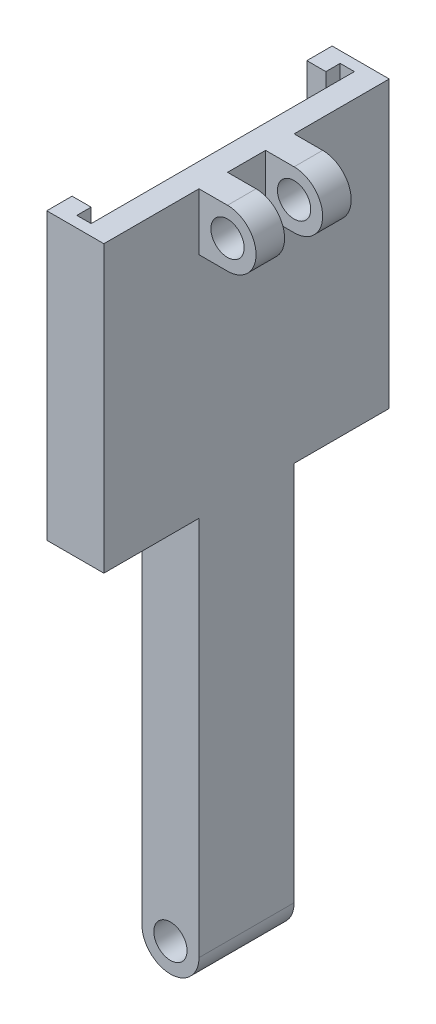
ISO-10303-21;
HEADER;
FILE_DESCRIPTION(('STEP AP214'),'2;1');
FILE_NAME('part.step','',(''),(''),'','','');
FILE_SCHEMA(('AUTOMOTIVE_DESIGN { 1 0 10303 214 1 1 1 1 }'));
ENDSEC;
DATA;
#1=APPLICATION_CONTEXT('core data for automotive mechanical design processes');
#2=APPLICATION_PROTOCOL_DEFINITION('international standard','automotive_design',2000,#1);
#3=PRODUCT_CONTEXT('',#1,'mechanical');
#4=PRODUCT('Part','Part','',(#3));
#5=PRODUCT_RELATED_PRODUCT_CATEGORY('part','',(#4));
#6=PRODUCT_DEFINITION_FORMATION('','',#4);
#7=PRODUCT_DEFINITION_CONTEXT('part definition',#1,'design');
#8=PRODUCT_DEFINITION('design','',#6,#7);
#9=PRODUCT_DEFINITION_SHAPE('','',#8);
#10=(LENGTH_UNIT() NAMED_UNIT(*) SI_UNIT(.MILLI.,.METRE.));
#11=(NAMED_UNIT(*) PLANE_ANGLE_UNIT() SI_UNIT($,.RADIAN.));
#12=(NAMED_UNIT(*) SI_UNIT($,.STERADIAN.) SOLID_ANGLE_UNIT());
#13=UNCERTAINTY_MEASURE_WITH_UNIT(LENGTH_MEASURE(1.E-05),#10,'distance_accuracy_value','');
#14=(GEOMETRIC_REPRESENTATION_CONTEXT(3) GLOBAL_UNCERTAINTY_ASSIGNED_CONTEXT((#13)) GLOBAL_UNIT_ASSIGNED_CONTEXT((#10,
#11,#12)) REPRESENTATION_CONTEXT('',''));
#15=CARTESIAN_POINT('',(0.,0.,0.));
#16=DIRECTION('',(0.,0.,1.));
#17=DIRECTION('',(1.,0.,0.));
#18=AXIS2_PLACEMENT_3D('',#15,#16,#17);
#19=CARTESIAN_POINT('',(6.,67.,-8.48528137423858));
#20=DIRECTION('',(0.,0.,1.));
#21=DIRECTION('',(1.,0.,0.));
#22=AXIS2_PLACEMENT_3D('',#19,#20,#21);
#23=CYLINDRICAL_SURFACE('',#22,3.);
#24=CARTESIAN_POINT('',(6.,67.,7.));
#25=DIRECTION('',(0.,0.,1.));
#26=DIRECTION('',(1.,0.,0.));
#27=AXIS2_PLACEMENT_3D('',#24,#25,#26);
#28=CIRCLE('',#27,3.);
#29=CARTESIAN_POINT('',(6.,70.,7.));
#30=VERTEX_POINT('',#29);
#31=CARTESIAN_POINT('',(6.,64.,7.));
#32=VERTEX_POINT('',#31);
#33=EDGE_CURVE('E257',#30,#32,#28,.F.);
#34=ORIENTED_EDGE('',*,*,#33,.F.);
#35=DIRECTION('',(0.,0.,1.));
#36=VECTOR('',#35,1.);
#37=CARTESIAN_POINT('',(6.,70.,-8.48528137423858));
#38=LINE('',#37,#36);
#39=CARTESIAN_POINT('',(6.,70.,10.));
#40=VERTEX_POINT('',#39);
#41=EDGE_CURVE('E260',#30,#40,#38,.T.);
#42=ORIENTED_EDGE('',*,*,#41,.T.);
#43=CARTESIAN_POINT('',(6.,67.,10.));
#44=DIRECTION('',(0.,0.,1.));
#45=DIRECTION('',(1.,0.,0.));
#46=AXIS2_PLACEMENT_3D('',#43,#44,#45);
#47=CIRCLE('',#46,3.);
#48=CARTESIAN_POINT('',(6.,64.,10.));
#49=VERTEX_POINT('',#48);
#50=EDGE_CURVE('E275',#49,#40,#47,.T.);
#51=ORIENTED_EDGE('',*,*,#50,.F.);
#52=DIRECTION('',(0.,0.,1.));
#53=VECTOR('',#52,1.);
#54=CARTESIAN_POINT('',(6.,64.,-8.48528137423858));
#55=LINE('',#54,#53);
#56=EDGE_CURVE('E294',#32,#49,#55,.T.);
#57=ORIENTED_EDGE('',*,*,#56,.F.);
#58=EDGE_LOOP('',(#34,#42,#51,#57));
#59=FACE_BOUND('',#58,.T.);
#60=ADVANCED_FACE('F54',(#59),#23,.T.);
#61=CARTESIAN_POINT('',(0.,64.,-8.48528137423858));
#62=DIRECTION('',(0.,1.,0.));
#63=DIRECTION('',(0.,0.,1.));
#64=AXIS2_PLACEMENT_3D('',#61,#62,#63);
#65=PLANE('',#64);
#66=DIRECTION('',(0.,0.,1.));
#67=VECTOR('',#66,1.);
#68=CARTESIAN_POINT('',(3.,64.,-8.48528137423858));
#69=LINE('',#68,#67);
#70=CARTESIAN_POINT('',(3.,64.,7.));
#71=VERTEX_POINT('',#70);
#72=CARTESIAN_POINT('',(3.,64.,10.));
#73=VERTEX_POINT('',#72);
#74=EDGE_CURVE('E265',#71,#73,#69,.T.);
#75=ORIENTED_EDGE('',*,*,#74,.F.);
#76=DIRECTION('',(-1.,0.,0.));
#77=VECTOR('',#76,1.);
#78=CARTESIAN_POINT('',(9.,64.,7.));
#79=LINE('',#78,#77);
#80=EDGE_CURVE('E249',#32,#71,#79,.T.);
#81=ORIENTED_EDGE('',*,*,#80,.F.);
#82=ORIENTED_EDGE('',*,*,#56,.T.);
#83=DIRECTION('',(-1.,0.,0.));
#84=VECTOR('',#83,1.);
#85=CARTESIAN_POINT('',(0.,64.,10.));
#86=LINE('',#85,#84);
#87=EDGE_CURVE('E261',#49,#73,#86,.T.);
#88=ORIENTED_EDGE('',*,*,#87,.T.);
#89=EDGE_LOOP('',(#75,#81,#82,#88));
#90=FACE_BOUND('',#89,.T.);
#91=ADVANCED_FACE('F489',(#90),#65,.F.);
#92=CARTESIAN_POINT('',(6.,67.,-8.48528137423858));
#93=DIRECTION('',(0.,0.,1.));
#94=DIRECTION('',(1.,0.,0.));
#95=AXIS2_PLACEMENT_3D('',#92,#93,#94);
#96=CYLINDRICAL_SURFACE('',#95,1.75);
#97=CARTESIAN_POINT('',(6.,67.,7.));
#98=DIRECTION('',(0.,0.,1.));
#99=DIRECTION('',(1.,0.,0.));
#100=AXIS2_PLACEMENT_3D('',#97,#98,#99);
#101=CIRCLE('',#100,1.75);
#102=CARTESIAN_POINT('',(7.75,67.,7.));
#103=VERTEX_POINT('',#102);
#104=EDGE_CURVE('E58',#103,#103,#101,.F.);
#105=ORIENTED_EDGE('',*,*,#104,.T.);
#106=EDGE_LOOP('',(#105));
#107=FACE_BOUND('',#106,.T.);
#108=CARTESIAN_POINT('',(6.,67.,10.));
#109=DIRECTION('',(0.,0.,1.));
#110=DIRECTION('',(1.,0.,0.));
#111=AXIS2_PLACEMENT_3D('',#108,#109,#110);
#112=CIRCLE('',#111,1.75);
#113=CARTESIAN_POINT('',(7.75,67.,10.));
#114=VERTEX_POINT('',#113);
#115=EDGE_CURVE('E279',#114,#114,#112,.T.);
#116=ORIENTED_EDGE('',*,*,#115,.T.);
#117=EDGE_LOOP('',(#116));
#118=FACE_BOUND('',#117,.T.);
#119=ADVANCED_FACE('F496',(#107,#118),#96,.F.);
#120=CARTESIAN_POINT('',(0.,0.,10.));
#121=DIRECTION('',(0.,0.,1.));
#122=DIRECTION('',(1.,0.,0.));
#123=AXIS2_PLACEMENT_3D('',#120,#121,#122);
#124=PLANE('',#123);
#125=DIRECTION('',(1.,0.,0.));
#126=VECTOR('',#125,1.);
#127=CARTESIAN_POINT('',(0.,40.,10.));
#128=LINE('',#127,#126);
#129=CARTESIAN_POINT('',(-3.,40.,10.));
#130=VERTEX_POINT('',#129);
#131=CARTESIAN_POINT('',(3.,40.,10.));
#132=VERTEX_POINT('',#131);
#133=EDGE_CURVE('E427',#130,#132,#128,.T.);
#134=ORIENTED_EDGE('',*,*,#133,.F.);
#135=DIRECTION('',(0.,1.,0.));
#136=VECTOR('',#135,1.);
#137=CARTESIAN_POINT('',(-3.,0.,10.));
#138=LINE('',#137,#136);
#139=CARTESIAN_POINT('',(-3.,0.,10.));
#140=VERTEX_POINT('',#139);
#141=EDGE_CURVE('E448',#140,#130,#138,.T.);
#142=ORIENTED_EDGE('',*,*,#141,.F.);
#143=CARTESIAN_POINT('',(0.,0.,10.));
#144=DIRECTION('',(0.,0.,1.));
#145=DIRECTION('',(1.,0.,0.));
#146=AXIS2_PLACEMENT_3D('',#143,#144,#145);
#147=CIRCLE('',#146,3.);
#148=CARTESIAN_POINT('',(3.,0.,10.));
#149=VERTEX_POINT('',#148);
#150=EDGE_CURVE('E439',#140,#149,#147,.T.);
#151=ORIENTED_EDGE('',*,*,#150,.T.);
#152=DIRECTION('',(0.,1.,0.));
#153=VECTOR('',#152,1.);
#154=CARTESIAN_POINT('',(3.,0.,10.));
#155=LINE('',#154,#153);
#156=EDGE_CURVE('E443',#149,#132,#155,.T.);
#157=ORIENTED_EDGE('',*,*,#156,.T.);
#158=EDGE_LOOP('',(#134,#142,#151,#157));
#159=FACE_BOUND('',#158,.T.);
#160=CARTESIAN_POINT('',(0.,0.,10.));
#161=DIRECTION('',(0.,0.,1.));
#162=DIRECTION('',(1.,0.,0.));
#163=AXIS2_PLACEMENT_3D('',#160,#161,#162);
#164=CIRCLE('',#163,1.75);
#165=CARTESIAN_POINT('',(1.75,0.,10.));
#166=VERTEX_POINT('',#165);
#167=EDGE_CURVE('E431',#166,#166,#164,.T.);
#168=ORIENTED_EDGE('',*,*,#167,.F.);
#169=EDGE_LOOP('',(#168));
#170=FACE_BOUND('',#169,.T.);
#171=ADVANCED_FACE('F538',(#159,#170),#124,.T.);
#172=CARTESIAN_POINT('',(0.,0.,0.));
#173=DIRECTION('',(0.,0.,1.));
#174=DIRECTION('',(1.,0.,0.));
#175=AXIS2_PLACEMENT_3D('',#172,#173,#174);
#176=PLANE('',#175);
#177=DIRECTION('',(0.,1.,0.));
#178=VECTOR('',#177,1.);
#179=CARTESIAN_POINT('',(-3.,0.,0.));
#180=LINE('',#179,#178);
#181=CARTESIAN_POINT('',(-3.,0.,0.));
#182=VERTEX_POINT('',#181);
#183=CARTESIAN_POINT('',(-3.,40.,0.));
#184=VERTEX_POINT('',#183);
#185=EDGE_CURVE('E444',#182,#184,#180,.T.);
#186=ORIENTED_EDGE('',*,*,#185,.T.);
#187=DIRECTION('',(1.,0.,0.));
#188=VECTOR('',#187,1.);
#189=CARTESIAN_POINT('',(0.,40.,0.));
#190=LINE('',#189,#188);
#191=CARTESIAN_POINT('',(3.,40.,0.));
#192=VERTEX_POINT('',#191);
#193=EDGE_CURVE('E414',#184,#192,#190,.T.);
#194=ORIENTED_EDGE('',*,*,#193,.T.);
#195=DIRECTION('',(0.,1.,0.));
#196=VECTOR('',#195,1.);
#197=CARTESIAN_POINT('',(3.,0.,0.));
#198=LINE('',#197,#196);
#199=CARTESIAN_POINT('',(3.,0.,0.));
#200=VERTEX_POINT('',#199);
#201=EDGE_CURVE('E456',#200,#192,#198,.T.);
#202=ORIENTED_EDGE('',*,*,#201,.F.);
#203=CARTESIAN_POINT('',(0.,0.,0.));
#204=DIRECTION('',(0.,0.,1.));
#205=DIRECTION('',(1.,0.,0.));
#206=AXIS2_PLACEMENT_3D('',#203,#204,#205);
#207=CIRCLE('',#206,3.);
#208=EDGE_CURVE('E435',#182,#200,#207,.T.);
#209=ORIENTED_EDGE('',*,*,#208,.F.);
#210=EDGE_LOOP('',(#186,#194,#202,#209));
#211=FACE_BOUND('',#210,.T.);
#212=CARTESIAN_POINT('',(0.,0.,0.));
#213=DIRECTION('',(0.,0.,1.));
#214=DIRECTION('',(1.,0.,0.));
#215=AXIS2_PLACEMENT_3D('',#212,#213,#214);
#216=CIRCLE('',#215,1.75);
#217=CARTESIAN_POINT('',(1.75,0.,0.));
#218=VERTEX_POINT('',#217);
#219=EDGE_CURVE('E430',#218,#218,#216,.T.);
#220=ORIENTED_EDGE('',*,*,#219,.T.);
#221=EDGE_LOOP('',(#220));
#222=FACE_BOUND('',#221,.T.);
#223=ADVANCED_FACE('F633',(#211,#222),#176,.F.);
#224=CARTESIAN_POINT('',(0.,0.,10.));
#225=DIRECTION('',(0.,0.,-1.));
#226=DIRECTION('',(-1.,0.,0.));
#227=AXIS2_PLACEMENT_3D('',#224,#225,#226);
#228=CYLINDRICAL_SURFACE('',#227,3.);
#229=ORIENTED_EDGE('',*,*,#208,.T.);
#230=DIRECTION('',(0.,0.,-1.));
#231=VECTOR('',#230,1.);
#232=CARTESIAN_POINT('',(3.,0.,10.));
#233=LINE('',#232,#231);
#234=EDGE_CURVE('E12',#149,#200,#233,.T.);
#235=ORIENTED_EDGE('',*,*,#234,.F.);
#236=ORIENTED_EDGE('',*,*,#150,.F.);
#237=DIRECTION('',(0.,0.,-1.));
#238=VECTOR('',#237,1.);
#239=CARTESIAN_POINT('',(-3.,0.,10.));
#240=LINE('',#239,#238);
#241=EDGE_CURVE('E452',#140,#182,#240,.T.);
#242=ORIENTED_EDGE('',*,*,#241,.T.);
#243=EDGE_LOOP('',(#229,#235,#236,#242));
#244=FACE_BOUND('',#243,.T.);
#245=ADVANCED_FACE('F56',(#244),#228,.T.);
#246=CARTESIAN_POINT('',(3.,0.,10.));
#247=DIRECTION('',(-1.,0.,0.));
#248=DIRECTION('',(0.,0.,1.));
#249=AXIS2_PLACEMENT_3D('',#246,#247,#248);
#250=PLANE('',#249);
#251=CARTESIAN_POINT('',(3.,64.,0.));
#252=VERTEX_POINT('',#251);
#253=CARTESIAN_POINT('',(3.,64.,3.));
#254=VERTEX_POINT('',#253);
#255=EDGE_CURVE('E234',#252,#254,#69,.T.);
#256=ORIENTED_EDGE('',*,*,#255,.T.);
#257=DIRECTION('',(0.,1.,0.));
#258=VECTOR('',#257,1.);
#259=CARTESIAN_POINT('',(3.,56.788897449072,3.));
#260=LINE('',#259,#258);
#261=CARTESIAN_POINT('',(3.,70.,3.));
#262=VERTEX_POINT('',#261);
#263=EDGE_CURVE('E72',#254,#262,#260,.T.);
#264=ORIENTED_EDGE('',*,*,#263,.T.);
#265=DIRECTION('',(0.,0.,1.));
#266=VECTOR('',#265,1.);
#267=CARTESIAN_POINT('',(3.,70.,3.));
#268=LINE('',#267,#266);
#269=CARTESIAN_POINT('',(3.,70.,7.));
#270=VERTEX_POINT('',#269);
#271=EDGE_CURVE('E224',#262,#270,#268,.T.);
#272=ORIENTED_EDGE('',*,*,#271,.T.);
#273=DIRECTION('',(0.,1.,0.));
#274=VECTOR('',#273,1.);
#275=CARTESIAN_POINT('',(3.,56.788897449072,7.));
#276=LINE('',#275,#274);
#277=EDGE_CURVE('E236',#71,#270,#276,.T.);
#278=ORIENTED_EDGE('',*,*,#277,.F.);
#279=ORIENTED_EDGE('',*,*,#74,.T.);
#280=DIRECTION('',(0.,-1.,0.));
#281=VECTOR('',#280,1.);
#282=CARTESIAN_POINT('',(3.,0.,10.));
#283=LINE('',#282,#281);
#284=CARTESIAN_POINT('',(3.,70.,10.));
#285=VERTEX_POINT('',#284);
#286=EDGE_CURVE('E267',#285,#73,#283,.T.);
#287=ORIENTED_EDGE('',*,*,#286,.F.);
#288=DIRECTION('',(0.,0.,-1.));
#289=VECTOR('',#288,1.);
#290=CARTESIAN_POINT('',(3.,70.,10.));
#291=LINE('',#290,#289);
#292=CARTESIAN_POINT('',(3.,70.,20.));
#293=VERTEX_POINT('',#292);
#294=EDGE_CURVE('E64',#293,#285,#291,.T.);
#295=ORIENTED_EDGE('',*,*,#294,.F.);
#296=DIRECTION('',(0.,1.,0.));
#297=VECTOR('',#296,1.);
#298=CARTESIAN_POINT('',(3.,70.,20.));
#299=LINE('',#298,#297);
#300=CARTESIAN_POINT('',(3.,40.,20.));
#301=VERTEX_POINT('',#300);
#302=EDGE_CURVE('E394',#301,#293,#299,.T.);
#303=ORIENTED_EDGE('',*,*,#302,.F.);
#304=DIRECTION('',(0.,0.,1.));
#305=VECTOR('',#304,1.);
#306=CARTESIAN_POINT('',(3.,40.,-9.99999999999999));
#307=LINE('',#306,#305);
#308=EDGE_CURVE('E388',#132,#301,#307,.T.);
#309=ORIENTED_EDGE('',*,*,#308,.F.);
#310=ORIENTED_EDGE('',*,*,#156,.F.);
#311=ORIENTED_EDGE('',*,*,#234,.T.);
#312=ORIENTED_EDGE('',*,*,#201,.T.);
#313=CARTESIAN_POINT('',(3.,40.,-9.99999999999999));
#314=VERTEX_POINT('',#313);
#315=EDGE_CURVE('E390',#314,#192,#307,.T.);
#316=ORIENTED_EDGE('',*,*,#315,.F.);
#317=DIRECTION('',(0.,-1.,0.));
#318=VECTOR('',#317,1.);
#319=CARTESIAN_POINT('',(3.,70.,-10.));
#320=LINE('',#319,#318);
#321=CARTESIAN_POINT('',(3.,70.,-10.));
#322=VERTEX_POINT('',#321);
#323=EDGE_CURVE('E384',#322,#314,#320,.T.);
#324=ORIENTED_EDGE('',*,*,#323,.F.);
#325=CARTESIAN_POINT('',(3.,70.,0.));
#326=VERTEX_POINT('',#325);
#327=EDGE_CURVE('E469',#326,#322,#291,.T.);
#328=ORIENTED_EDGE('',*,*,#327,.F.);
#329=DIRECTION('',(0.,1.,0.));
#330=VECTOR('',#329,1.);
#331=CARTESIAN_POINT('',(3.,0.,0.));
#332=LINE('',#331,#330);
#333=EDGE_CURVE('E290',#252,#326,#332,.T.);
#334=ORIENTED_EDGE('',*,*,#333,.F.);
#335=EDGE_LOOP('',(#256,#264,#272,#278,#279,#287,#295,#303,#309,#310,#311,#312,#316,#324,#328,#334));
#336=FACE_BOUND('',#335,.T.);
#337=ADVANCED_FACE('F229',(#336),#250,.F.);
#338=CARTESIAN_POINT('',(0.,70.,10.));
#339=DIRECTION('',(0.,1.,0.));
#340=DIRECTION('',(0.,0.,1.));
#341=AXIS2_PLACEMENT_3D('',#338,#339,#340);
#342=PLANE('',#341);
#343=DIRECTION('',(1.,0.,0.));
#344=VECTOR('',#343,1.);
#345=CARTESIAN_POINT('',(9.,70.,7.));
#346=LINE('',#345,#344);
#347=EDGE_CURVE('E237',#270,#30,#346,.T.);
#348=ORIENTED_EDGE('',*,*,#347,.F.);
#349=ORIENTED_EDGE('',*,*,#271,.F.);
#350=DIRECTION('',(-1.,0.,0.));
#351=VECTOR('',#350,1.);
#352=CARTESIAN_POINT('',(9.,70.,3.));
#353=LINE('',#352,#351);
#354=CARTESIAN_POINT('',(6.,70.,3.));
#355=VERTEX_POINT('',#354);
#356=EDGE_CURVE('E216',#355,#262,#353,.T.);
#357=ORIENTED_EDGE('',*,*,#356,.F.);
#358=CARTESIAN_POINT('',(6.,70.,0.));
#359=VERTEX_POINT('',#358);
#360=EDGE_CURVE('E297',#359,#355,#38,.T.);
#361=ORIENTED_EDGE('',*,*,#360,.F.);
#362=DIRECTION('',(1.,0.,0.));
#363=VECTOR('',#362,1.);
#364=CARTESIAN_POINT('',(0.,70.,0.));
#365=LINE('',#364,#363);
#366=EDGE_CURVE('E80',#326,#359,#365,.T.);
#367=ORIENTED_EDGE('',*,*,#366,.F.);
#368=ORIENTED_EDGE('',*,*,#327,.T.);
#369=DIRECTION('',(-1.,0.,0.));
#370=VECTOR('',#369,1.);
#371=CARTESIAN_POINT('',(3.,70.,-10.));
#372=LINE('',#371,#370);
#373=CARTESIAN_POINT('',(-3.,70.,-10.));
#374=VERTEX_POINT('',#373);
#375=EDGE_CURVE('E410',#322,#374,#372,.T.);
#376=ORIENTED_EDGE('',*,*,#375,.T.);
#377=DIRECTION('',(0.,0.,-1.));
#378=VECTOR('',#377,1.);
#379=CARTESIAN_POINT('',(-3.,70.,10.));
#380=LINE('',#379,#378);
#381=CARTESIAN_POINT('',(-3.,70.,-7.33942692561024));
#382=VERTEX_POINT('',#381);
#383=EDGE_CURVE('E464',#382,#374,#380,.T.);
#384=ORIENTED_EDGE('',*,*,#383,.F.);
#385=DIRECTION('',(1.,0.,0.));
#386=VECTOR('',#385,1.);
#387=CARTESIAN_POINT('',(0.,70.,-7.33942692561024));
#388=LINE('',#387,#386);
#389=CARTESIAN_POINT('',(-0.999999999999998,70.,-7.33942692561024));
#390=VERTEX_POINT('',#389);
#391=EDGE_CURVE('E313',#382,#390,#388,.T.);
#392=ORIENTED_EDGE('',*,*,#391,.T.);
#393=DIRECTION('',(0.,0.,1.));
#394=VECTOR('',#393,1.);
#395=CARTESIAN_POINT('',(-0.999999999999997,70.,0.));
#396=LINE('',#395,#394);
#397=CARTESIAN_POINT('',(-0.999999999999997,70.,-8.83942692561024));
#398=VERTEX_POINT('',#397);
#399=EDGE_CURVE('E344',#398,#390,#396,.T.);
#400=ORIENTED_EDGE('',*,*,#399,.F.);
#401=DIRECTION('',(1.,0.,0.));
#402=VECTOR('',#401,1.);
#403=CARTESIAN_POINT('',(0.,70.,-8.83942692561024));
#404=LINE('',#403,#402);
#405=CARTESIAN_POINT('',(0.500000000000003,70.,-8.83942692561024));
#406=VERTEX_POINT('',#405);
#407=EDGE_CURVE('E352',#398,#406,#404,.T.);
#408=ORIENTED_EDGE('',*,*,#407,.T.);
#409=DIRECTION('',(0.,0.,1.));
#410=VECTOR('',#409,1.);
#411=CARTESIAN_POINT('',(0.500000000000003,70.,0.));
#412=LINE('',#411,#410);
#413=CARTESIAN_POINT('',(0.500000000000003,70.,18.8394269256102));
#414=VERTEX_POINT('',#413);
#415=EDGE_CURVE('E348',#406,#414,#412,.T.);
#416=ORIENTED_EDGE('',*,*,#415,.T.);
#417=DIRECTION('',(1.,0.,0.));
#418=VECTOR('',#417,1.);
#419=CARTESIAN_POINT('',(0.,70.,18.8394269256102));
#420=LINE('',#419,#418);
#421=CARTESIAN_POINT('',(-0.999999999999997,70.,18.8394269256102));
#422=VERTEX_POINT('',#421);
#423=EDGE_CURVE('E343',#422,#414,#420,.T.);
#424=ORIENTED_EDGE('',*,*,#423,.F.);
#425=CARTESIAN_POINT('',(-0.999999999999997,70.,17.3394269256102));
#426=VERTEX_POINT('',#425);
#427=EDGE_CURVE('E339',#426,#422,#396,.T.);
#428=ORIENTED_EDGE('',*,*,#427,.F.);
#429=DIRECTION('',(1.,0.,0.));
#430=VECTOR('',#429,1.);
#431=CARTESIAN_POINT('',(0.,70.,17.3394269256102));
#432=LINE('',#431,#430);
#433=CARTESIAN_POINT('',(-3.,70.,17.3394269256102));
#434=VERTEX_POINT('',#433);
#435=EDGE_CURVE('E289',#434,#426,#432,.T.);
#436=ORIENTED_EDGE('',*,*,#435,.F.);
#437=CARTESIAN_POINT('',(-3.,70.,20.));
#438=VERTEX_POINT('',#437);
#439=EDGE_CURVE('E465',#438,#434,#380,.T.);
#440=ORIENTED_EDGE('',*,*,#439,.F.);
#441=DIRECTION('',(-1.,0.,0.));
#442=VECTOR('',#441,1.);
#443=CARTESIAN_POINT('',(3.,70.,20.));
#444=LINE('',#443,#442);
#445=EDGE_CURVE('E415',#293,#438,#444,.T.);
#446=ORIENTED_EDGE('',*,*,#445,.F.);
#447=ORIENTED_EDGE('',*,*,#294,.T.);
#448=DIRECTION('',(-1.,0.,0.));
#449=VECTOR('',#448,1.);
#450=CARTESIAN_POINT('',(0.,70.,10.));
#451=LINE('',#450,#449);
#452=EDGE_CURVE('E272',#40,#285,#451,.T.);
#453=ORIENTED_EDGE('',*,*,#452,.F.);
#454=ORIENTED_EDGE('',*,*,#41,.F.);
#455=EDGE_LOOP('',(#348,#349,#357,#361,#367,#368,#376,#384,#392,#400,#408,#416,#424,#428,#436,
#440,#446,#447,#453,#454));
#456=FACE_BOUND('',#455,.T.);
#457=ADVANCED_FACE('F239',(#456),#342,.T.);
#458=CARTESIAN_POINT('',(-3.,0.,10.));
#459=DIRECTION('',(-1.,0.,0.));
#460=DIRECTION('',(0.,-1.,0.));
#461=AXIS2_PLACEMENT_3D('',#458,#459,#460);
#462=PLANE('',#461);
#463=DIRECTION('',(0.,1.,0.));
#464=VECTOR('',#463,1.);
#465=CARTESIAN_POINT('',(-3.,42.,17.3394269256102));
#466=LINE('',#465,#464);
#467=CARTESIAN_POINT('',(-3.,42.,17.3394269256102));
#468=VERTEX_POINT('',#467);
#469=EDGE_CURVE('E359',#468,#434,#466,.T.);
#470=ORIENTED_EDGE('',*,*,#469,.F.);
#471=DIRECTION('',(0.,0.,1.));
#472=VECTOR('',#471,1.);
#473=CARTESIAN_POINT('',(-3.,42.,0.));
#474=LINE('',#473,#472);
#475=CARTESIAN_POINT('',(-3.,42.,-7.33942692561024));
#476=VERTEX_POINT('',#475);
#477=EDGE_CURVE('E331',#476,#468,#474,.T.);
#478=ORIENTED_EDGE('',*,*,#477,.F.);
#479=DIRECTION('',(0.,1.,0.));
#480=VECTOR('',#479,1.);
#481=CARTESIAN_POINT('',(-3.,42.,-7.33942692561024));
#482=LINE('',#481,#480);
#483=EDGE_CURVE('E363',#476,#382,#482,.T.);
#484=ORIENTED_EDGE('',*,*,#483,.T.);
#485=ORIENTED_EDGE('',*,*,#383,.T.);
#486=DIRECTION('',(0.,-1.,0.));
#487=VECTOR('',#486,1.);
#488=CARTESIAN_POINT('',(-3.,70.,-10.));
#489=LINE('',#488,#487);
#490=CARTESIAN_POINT('',(-3.,40.,-9.99999999999999));
#491=VERTEX_POINT('',#490);
#492=EDGE_CURVE('E362',#374,#491,#489,.T.);
#493=ORIENTED_EDGE('',*,*,#492,.T.);
#494=DIRECTION('',(0.,0.,1.));
#495=VECTOR('',#494,1.);
#496=CARTESIAN_POINT('',(-3.,40.,-9.99999999999999));
#497=LINE('',#496,#495);
#498=EDGE_CURVE('E403',#491,#184,#497,.T.);
#499=ORIENTED_EDGE('',*,*,#498,.T.);
#500=ORIENTED_EDGE('',*,*,#185,.F.);
#501=ORIENTED_EDGE('',*,*,#241,.F.);
#502=ORIENTED_EDGE('',*,*,#141,.T.);
#503=CARTESIAN_POINT('',(-3.,40.,20.));
#504=VERTEX_POINT('',#503);
#505=EDGE_CURVE('E402',#130,#504,#497,.T.);
#506=ORIENTED_EDGE('',*,*,#505,.T.);
#507=DIRECTION('',(0.,1.,0.));
#508=VECTOR('',#507,1.);
#509=CARTESIAN_POINT('',(-3.,70.,20.));
#510=LINE('',#509,#508);
#511=EDGE_CURVE('E389',#504,#438,#510,.T.);
#512=ORIENTED_EDGE('',*,*,#511,.T.);
#513=ORIENTED_EDGE('',*,*,#439,.T.);
#514=EDGE_LOOP('',(#470,#478,#484,#485,#493,#499,#500,#501,#502,#506,#512,#513));
#515=FACE_BOUND('',#514,.T.);
#516=ADVANCED_FACE('F568',(#515),#462,.T.);
#517=CARTESIAN_POINT('',(0.,0.,10.));
#518=DIRECTION('',(0.,0.,-1.));
#519=DIRECTION('',(-1.,0.,0.));
#520=AXIS2_PLACEMENT_3D('',#517,#518,#519);
#521=CYLINDRICAL_SURFACE('',#520,1.75);
#522=ORIENTED_EDGE('',*,*,#167,.T.);
#523=EDGE_LOOP('',(#522));
#524=FACE_BOUND('',#523,.T.);
#525=ORIENTED_EDGE('',*,*,#219,.F.);
#526=EDGE_LOOP('',(#525));
#527=FACE_BOUND('',#526,.T.);
#528=ADVANCED_FACE('F627',(#524,#527),#521,.F.);
#529=CARTESIAN_POINT('',(3.,70.,-10.));
#530=DIRECTION('',(0.,0.,-1.));
#531=DIRECTION('',(0.,1.,0.));
#532=AXIS2_PLACEMENT_3D('',#529,#530,#531);
#533=PLANE('',#532);
#534=ORIENTED_EDGE('',*,*,#492,.F.);
#535=ORIENTED_EDGE('',*,*,#375,.F.);
#536=ORIENTED_EDGE('',*,*,#323,.T.);
#537=DIRECTION('',(-1.,0.,0.));
#538=VECTOR('',#537,1.);
#539=CARTESIAN_POINT('',(3.,40.,-9.99999999999999));
#540=LINE('',#539,#538);
#541=EDGE_CURVE('E398',#314,#491,#540,.T.);
#542=ORIENTED_EDGE('',*,*,#541,.T.);
#543=EDGE_LOOP('',(#534,#535,#536,#542));
#544=FACE_BOUND('',#543,.T.);
#545=ADVANCED_FACE('F581',(#544),#533,.T.);
#546=CARTESIAN_POINT('',(3.,40.,-9.99999999999999));
#547=DIRECTION('',(0.,-1.,0.));
#548=DIRECTION('',(0.,0.,-1.));
#549=AXIS2_PLACEMENT_3D('',#546,#547,#548);
#550=PLANE('',#549);
#551=ORIENTED_EDGE('',*,*,#193,.F.);
#552=ORIENTED_EDGE('',*,*,#498,.F.);
#553=ORIENTED_EDGE('',*,*,#541,.F.);
#554=ORIENTED_EDGE('',*,*,#315,.T.);
#555=EDGE_LOOP('',(#551,#552,#553,#554));
#556=FACE_BOUND('',#555,.T.);
#557=ADVANCED_FACE('F577',(#556),#550,.T.);
#558=CARTESIAN_POINT('',(3.,70.,20.));
#559=DIRECTION('',(0.,0.,1.));
#560=DIRECTION('',(0.,-1.,0.));
#561=AXIS2_PLACEMENT_3D('',#558,#559,#560);
#562=PLANE('',#561);
#563=ORIENTED_EDGE('',*,*,#511,.F.);
#564=DIRECTION('',(-1.,0.,0.));
#565=VECTOR('',#564,1.);
#566=CARTESIAN_POINT('',(3.,40.,20.));
#567=LINE('',#566,#565);
#568=EDGE_CURVE('E419',#301,#504,#567,.T.);
#569=ORIENTED_EDGE('',*,*,#568,.F.);
#570=ORIENTED_EDGE('',*,*,#302,.T.);
#571=ORIENTED_EDGE('',*,*,#445,.T.);
#572=EDGE_LOOP('',(#563,#569,#570,#571));
#573=FACE_BOUND('',#572,.T.);
#574=ADVANCED_FACE('F559',(#573),#562,.T.);
#575=ORIENTED_EDGE('',*,*,#505,.F.);
#576=ORIENTED_EDGE('',*,*,#133,.T.);
#577=ORIENTED_EDGE('',*,*,#308,.T.);
#578=ORIENTED_EDGE('',*,*,#568,.T.);
#579=EDGE_LOOP('',(#575,#576,#577,#578));
#580=FACE_BOUND('',#579,.T.);
#581=ADVANCED_FACE('F561',(#580),#550,.T.);
#582=CARTESIAN_POINT('',(0.,42.,17.3394269256102));
#583=DIRECTION('',(0.,0.,1.));
#584=DIRECTION('',(1.,0.,0.));
#585=AXIS2_PLACEMENT_3D('',#582,#583,#584);
#586=PLANE('',#585);
#587=ORIENTED_EDGE('',*,*,#435,.T.);
#588=DIRECTION('',(0.,1.,0.));
#589=VECTOR('',#588,1.);
#590=CARTESIAN_POINT('',(-0.999999999999997,42.,17.3394269256102));
#591=LINE('',#590,#589);
#592=CARTESIAN_POINT('',(-0.999999999999997,42.,17.3394269256102));
#593=VERTEX_POINT('',#592);
#594=EDGE_CURVE('E335',#593,#426,#591,.T.);
#595=ORIENTED_EDGE('',*,*,#594,.F.);
#596=DIRECTION('',(1.,0.,0.));
#597=VECTOR('',#596,1.);
#598=CARTESIAN_POINT('',(0.,42.,17.3394269256102));
#599=LINE('',#598,#597);
#600=EDGE_CURVE('E308',#468,#593,#599,.T.);
#601=ORIENTED_EDGE('',*,*,#600,.F.);
#602=ORIENTED_EDGE('',*,*,#469,.T.);
#603=EDGE_LOOP('',(#587,#595,#601,#602));
#604=FACE_BOUND('',#603,.T.);
#605=ADVANCED_FACE('F611',(#604),#586,.F.);
#606=CARTESIAN_POINT('',(0.,42.,-7.33942692561024));
#607=DIRECTION('',(0.,0.,1.));
#608=DIRECTION('',(1.,0.,0.));
#609=AXIS2_PLACEMENT_3D('',#606,#607,#608);
#610=PLANE('',#609);
#611=ORIENTED_EDGE('',*,*,#391,.F.);
#612=ORIENTED_EDGE('',*,*,#483,.F.);
#613=DIRECTION('',(1.,0.,0.));
#614=VECTOR('',#613,1.);
#615=CARTESIAN_POINT('',(0.,42.,-7.33942692561024));
#616=LINE('',#615,#614);
#617=CARTESIAN_POINT('',(-0.999999999999998,42.,-7.33942692561024));
#618=VERTEX_POINT('',#617);
#619=EDGE_CURVE('E328',#476,#618,#616,.T.);
#620=ORIENTED_EDGE('',*,*,#619,.T.);
#621=DIRECTION('',(0.,1.,0.));
#622=VECTOR('',#621,1.);
#623=CARTESIAN_POINT('',(-0.999999999999998,42.,-7.33942692561024));
#624=LINE('',#623,#622);
#625=EDGE_CURVE('E367',#618,#390,#624,.T.);
#626=ORIENTED_EDGE('',*,*,#625,.T.);
#627=EDGE_LOOP('',(#611,#612,#620,#626));
#628=FACE_BOUND('',#627,.T.);
#629=ADVANCED_FACE('F587',(#628),#610,.T.);
#630=CARTESIAN_POINT('',(-0.999999999999997,42.,0.));
#631=DIRECTION('',(-1.,0.,0.));
#632=DIRECTION('',(0.,0.,1.));
#633=AXIS2_PLACEMENT_3D('',#630,#631,#632);
#634=PLANE('',#633);
#635=ORIENTED_EDGE('',*,*,#399,.T.);
#636=ORIENTED_EDGE('',*,*,#625,.F.);
#637=DIRECTION('',(0.,0.,1.));
#638=VECTOR('',#637,1.);
#639=CARTESIAN_POINT('',(-0.999999999999997,42.,0.));
#640=LINE('',#639,#638);
#641=CARTESIAN_POINT('',(-0.999999999999997,42.,-8.83942692561024));
#642=VERTEX_POINT('',#641);
#643=EDGE_CURVE('E318',#642,#618,#640,.T.);
#644=ORIENTED_EDGE('',*,*,#643,.F.);
#645=DIRECTION('',(0.,1.,0.));
#646=VECTOR('',#645,1.);
#647=CARTESIAN_POINT('',(-0.999999999999997,42.,-8.83942692561024));
#648=LINE('',#647,#646);
#649=EDGE_CURVE('E370',#642,#398,#648,.T.);
#650=ORIENTED_EDGE('',*,*,#649,.T.);
#651=EDGE_LOOP('',(#635,#636,#644,#650));
#652=FACE_BOUND('',#651,.T.);
#653=ADVANCED_FACE('F591',(#652),#634,.F.);
#654=CARTESIAN_POINT('',(0.,42.,-8.83942692561024));
#655=DIRECTION('',(0.,0.,1.));
#656=DIRECTION('',(1.,0.,0.));
#657=AXIS2_PLACEMENT_3D('',#654,#655,#656);
#658=PLANE('',#657);
#659=ORIENTED_EDGE('',*,*,#407,.F.);
#660=ORIENTED_EDGE('',*,*,#649,.F.);
#661=DIRECTION('',(1.,0.,0.));
#662=VECTOR('',#661,1.);
#663=CARTESIAN_POINT('',(0.,42.,-8.83942692561024));
#664=LINE('',#663,#662);
#665=CARTESIAN_POINT('',(0.500000000000003,42.,-8.83942692561024));
#666=VERTEX_POINT('',#665);
#667=EDGE_CURVE('E325',#642,#666,#664,.T.);
#668=ORIENTED_EDGE('',*,*,#667,.T.);
#669=DIRECTION('',(0.,1.,0.));
#670=VECTOR('',#669,1.);
#671=CARTESIAN_POINT('',(0.500000000000003,42.,-8.83942692561024));
#672=LINE('',#671,#670);
#673=EDGE_CURVE('E373',#666,#406,#672,.T.);
#674=ORIENTED_EDGE('',*,*,#673,.T.);
#675=EDGE_LOOP('',(#659,#660,#668,#674));
#676=FACE_BOUND('',#675,.T.);
#677=ADVANCED_FACE('F596',(#676),#658,.T.);
#678=CARTESIAN_POINT('',(0.500000000000003,42.,0.));
#679=DIRECTION('',(-1.,0.,0.));
#680=DIRECTION('',(0.,0.,1.));
#681=AXIS2_PLACEMENT_3D('',#678,#679,#680);
#682=PLANE('',#681);
#683=ORIENTED_EDGE('',*,*,#415,.F.);
#684=ORIENTED_EDGE('',*,*,#673,.F.);
#685=DIRECTION('',(0.,0.,1.));
#686=VECTOR('',#685,1.);
#687=CARTESIAN_POINT('',(0.500000000000003,42.,0.));
#688=LINE('',#687,#686);
#689=CARTESIAN_POINT('',(0.500000000000003,42.,18.8394269256102));
#690=VERTEX_POINT('',#689);
#691=EDGE_CURVE('E322',#666,#690,#688,.T.);
#692=ORIENTED_EDGE('',*,*,#691,.T.);
#693=DIRECTION('',(0.,1.,0.));
#694=VECTOR('',#693,1.);
#695=CARTESIAN_POINT('',(0.500000000000003,42.,18.8394269256102));
#696=LINE('',#695,#694);
#697=EDGE_CURVE('E376',#690,#414,#696,.T.);
#698=ORIENTED_EDGE('',*,*,#697,.T.);
#699=EDGE_LOOP('',(#683,#684,#692,#698));
#700=FACE_BOUND('',#699,.T.);
#701=ADVANCED_FACE('F601',(#700),#682,.T.);
#702=CARTESIAN_POINT('',(0.,42.,18.8394269256102));
#703=DIRECTION('',(0.,0.,1.));
#704=DIRECTION('',(1.,0.,0.));
#705=AXIS2_PLACEMENT_3D('',#702,#703,#704);
#706=PLANE('',#705);
#707=ORIENTED_EDGE('',*,*,#423,.T.);
#708=ORIENTED_EDGE('',*,*,#697,.F.);
#709=DIRECTION('',(1.,0.,0.));
#710=VECTOR('',#709,1.);
#711=CARTESIAN_POINT('',(0.,42.,18.8394269256102));
#712=LINE('',#711,#710);
#713=CARTESIAN_POINT('',(-0.999999999999997,42.,18.8394269256102));
#714=VERTEX_POINT('',#713);
#715=EDGE_CURVE('E317',#714,#690,#712,.T.);
#716=ORIENTED_EDGE('',*,*,#715,.F.);
#717=DIRECTION('',(0.,1.,0.));
#718=VECTOR('',#717,1.);
#719=CARTESIAN_POINT('',(-0.999999999999997,42.,18.8394269256102));
#720=LINE('',#719,#718);
#721=EDGE_CURVE('E379',#714,#422,#720,.T.);
#722=ORIENTED_EDGE('',*,*,#721,.T.);
#723=EDGE_LOOP('',(#707,#708,#716,#722));
#724=FACE_BOUND('',#723,.T.);
#725=ADVANCED_FACE('F605',(#724),#706,.F.);
#726=ORIENTED_EDGE('',*,*,#427,.T.);
#727=ORIENTED_EDGE('',*,*,#721,.F.);
#728=EDGE_CURVE('E312',#593,#714,#640,.T.);
#729=ORIENTED_EDGE('',*,*,#728,.F.);
#730=ORIENTED_EDGE('',*,*,#594,.T.);
#731=EDGE_LOOP('',(#726,#727,#729,#730));
#732=FACE_BOUND('',#731,.T.);
#733=ADVANCED_FACE('F509',(#732),#634,.F.);
#734=CARTESIAN_POINT('',(0.,42.,0.));
#735=DIRECTION('',(0.,1.,0.));
#736=DIRECTION('',(0.,0.,1.));
#737=AXIS2_PLACEMENT_3D('',#734,#735,#736);
#738=PLANE('',#737);
#739=ORIENTED_EDGE('',*,*,#600,.T.);
#740=ORIENTED_EDGE('',*,*,#728,.T.);
#741=ORIENTED_EDGE('',*,*,#715,.T.);
#742=ORIENTED_EDGE('',*,*,#691,.F.);
#743=ORIENTED_EDGE('',*,*,#667,.F.);
#744=ORIENTED_EDGE('',*,*,#643,.T.);
#745=ORIENTED_EDGE('',*,*,#619,.F.);
#746=ORIENTED_EDGE('',*,*,#477,.T.);
#747=EDGE_LOOP('',(#739,#740,#741,#742,#743,#744,#745,#746));
#748=FACE_BOUND('',#747,.T.);
#749=ADVANCED_FACE('F502',(#748),#738,.T.);
#750=CARTESIAN_POINT('',(6.,67.,3.));
#751=DIRECTION('',(0.,0.,-1.));
#752=DIRECTION('',(-1.,0.,0.));
#753=AXIS2_PLACEMENT_3D('',#750,#751,#752);
#754=CIRCLE('',#753,3.);
#755=CARTESIAN_POINT('',(6.,64.,3.));
#756=VERTEX_POINT('',#755);
#757=EDGE_CURVE('E220',#756,#355,#754,.F.);
#758=ORIENTED_EDGE('',*,*,#757,.F.);
#759=CARTESIAN_POINT('',(6.,64.,0.));
#760=VERTEX_POINT('',#759);
#761=EDGE_CURVE('E266',#760,#756,#55,.T.);
#762=ORIENTED_EDGE('',*,*,#761,.F.);
#763=CARTESIAN_POINT('',(6.,67.,0.));
#764=DIRECTION('',(0.,0.,1.));
#765=DIRECTION('',(1.,0.,0.));
#766=AXIS2_PLACEMENT_3D('',#763,#764,#765);
#767=CIRCLE('',#766,3.);
#768=EDGE_CURVE('E271',#359,#760,#767,.F.);
#769=ORIENTED_EDGE('',*,*,#768,.F.);
#770=ORIENTED_EDGE('',*,*,#360,.T.);
#771=EDGE_LOOP('',(#758,#762,#769,#770));
#772=FACE_BOUND('',#771,.T.);
#773=ADVANCED_FACE('F492',(#772),#23,.T.);
#774=ORIENTED_EDGE('',*,*,#761,.T.);
#775=DIRECTION('',(1.,0.,0.));
#776=VECTOR('',#775,1.);
#777=CARTESIAN_POINT('',(9.,64.,3.));
#778=LINE('',#777,#776);
#779=EDGE_CURVE('E251',#254,#756,#778,.T.);
#780=ORIENTED_EDGE('',*,*,#779,.F.);
#781=ORIENTED_EDGE('',*,*,#255,.F.);
#782=DIRECTION('',(1.,0.,0.));
#783=VECTOR('',#782,1.);
#784=CARTESIAN_POINT('',(0.,64.,0.));
#785=LINE('',#784,#783);
#786=EDGE_CURVE('E300',#252,#760,#785,.T.);
#787=ORIENTED_EDGE('',*,*,#786,.T.);
#788=EDGE_LOOP('',(#774,#780,#781,#787));
#789=FACE_BOUND('',#788,.T.);
#790=ADVANCED_FACE('F499',(#789),#65,.F.);
#791=CARTESIAN_POINT('',(6.,67.,3.));
#792=DIRECTION('',(0.,0.,-1.));
#793=DIRECTION('',(-1.,0.,0.));
#794=AXIS2_PLACEMENT_3D('',#791,#792,#793);
#795=CIRCLE('',#794,1.75);
#796=CARTESIAN_POINT('',(4.25,67.,3.));
#797=VERTEX_POINT('',#796);
#798=EDGE_CURVE('E254',#797,#797,#795,.F.);
#799=ORIENTED_EDGE('',*,*,#798,.T.);
#800=EDGE_LOOP('',(#799));
#801=FACE_BOUND('',#800,.T.);
#802=CARTESIAN_POINT('',(6.,67.,0.));
#803=DIRECTION('',(0.,0.,1.));
#804=DIRECTION('',(1.,0.,0.));
#805=AXIS2_PLACEMENT_3D('',#802,#803,#804);
#806=CIRCLE('',#805,1.75);
#807=CARTESIAN_POINT('',(7.75,67.,0.));
#808=VERTEX_POINT('',#807);
#809=EDGE_CURVE('E283',#808,#808,#806,.F.);
#810=ORIENTED_EDGE('',*,*,#809,.T.);
#811=EDGE_LOOP('',(#810));
#812=FACE_BOUND('',#811,.T.);
#813=ADVANCED_FACE('F476',(#801,#812),#96,.F.);
#814=CARTESIAN_POINT('',(0.,0.,10.));
#815=DIRECTION('',(0.,0.,1.));
#816=DIRECTION('',(1.,0.,0.));
#817=AXIS2_PLACEMENT_3D('',#814,#815,#816);
#818=PLANE('',#817);
#819=ORIENTED_EDGE('',*,*,#115,.F.);
#820=EDGE_LOOP('',(#819));
#821=FACE_BOUND('',#820,.T.);
#822=ORIENTED_EDGE('',*,*,#50,.T.);
#823=ORIENTED_EDGE('',*,*,#452,.T.);
#824=ORIENTED_EDGE('',*,*,#286,.T.);
#825=ORIENTED_EDGE('',*,*,#87,.F.);
#826=EDGE_LOOP('',(#822,#823,#824,#825));
#827=FACE_BOUND('',#826,.T.);
#828=ADVANCED_FACE('F542',(#821,#827),#818,.T.);
#829=CARTESIAN_POINT('',(0.,0.,0.));
#830=DIRECTION('',(0.,0.,1.));
#831=DIRECTION('',(1.,0.,0.));
#832=AXIS2_PLACEMENT_3D('',#829,#830,#831);
#833=PLANE('',#832);
#834=ORIENTED_EDGE('',*,*,#768,.T.);
#835=ORIENTED_EDGE('',*,*,#786,.F.);
#836=ORIENTED_EDGE('',*,*,#333,.T.);
#837=ORIENTED_EDGE('',*,*,#366,.T.);
#838=EDGE_LOOP('',(#834,#835,#836,#837));
#839=FACE_BOUND('',#838,.T.);
#840=ORIENTED_EDGE('',*,*,#809,.F.);
#841=EDGE_LOOP('',(#840));
#842=FACE_BOUND('',#841,.T.);
#843=ADVANCED_FACE('F484',(#839,#842),#833,.F.);
#844=CARTESIAN_POINT('',(9.,56.788897449072,7.));
#845=DIRECTION('',(0.,0.,1.));
#846=DIRECTION('',(1.,0.,0.));
#847=AXIS2_PLACEMENT_3D('',#844,#845,#846);
#848=PLANE('',#847);
#849=ORIENTED_EDGE('',*,*,#33,.T.);
#850=ORIENTED_EDGE('',*,*,#80,.T.);
#851=ORIENTED_EDGE('',*,*,#277,.T.);
#852=ORIENTED_EDGE('',*,*,#347,.T.);
#853=EDGE_LOOP('',(#849,#850,#851,#852));
#854=FACE_BOUND('',#853,.T.);
#855=ORIENTED_EDGE('',*,*,#104,.F.);
#856=EDGE_LOOP('',(#855));
#857=FACE_BOUND('',#856,.T.);
#858=ADVANCED_FACE('F479',(#854,#857),#848,.F.);
#859=CARTESIAN_POINT('',(9.,56.788897449072,3.));
#860=DIRECTION('',(0.,0.,-1.));
#861=DIRECTION('',(-1.,0.,0.));
#862=AXIS2_PLACEMENT_3D('',#859,#860,#861);
#863=PLANE('',#862);
#864=ORIENTED_EDGE('',*,*,#757,.T.);
#865=ORIENTED_EDGE('',*,*,#356,.T.);
#866=ORIENTED_EDGE('',*,*,#263,.F.);
#867=ORIENTED_EDGE('',*,*,#779,.T.);
#868=EDGE_LOOP('',(#864,#865,#866,#867));
#869=FACE_BOUND('',#868,.T.);
#870=ORIENTED_EDGE('',*,*,#798,.F.);
#871=EDGE_LOOP('',(#870));
#872=FACE_BOUND('',#871,.T.);
#873=ADVANCED_FACE('F217',(#869,#872),#863,.F.);
#874=CLOSED_SHELL('',(#60,#91,#119,#171,#223,#245,#337,#457,#516,#528,#545,#557,#574,#581,#605,
#629,#653,#677,#701,#725,#733,#749,#773,#790,#813,#828,#843,#858,#873));
#875=MANIFOLD_SOLID_BREP('B2',#874);
#876=ADVANCED_BREP_SHAPE_REPRESENTATION('',(#18,#875),#14);
#877=SHAPE_DEFINITION_REPRESENTATION(#9,#876);
ENDSEC;
END-ISO-10303-21;
